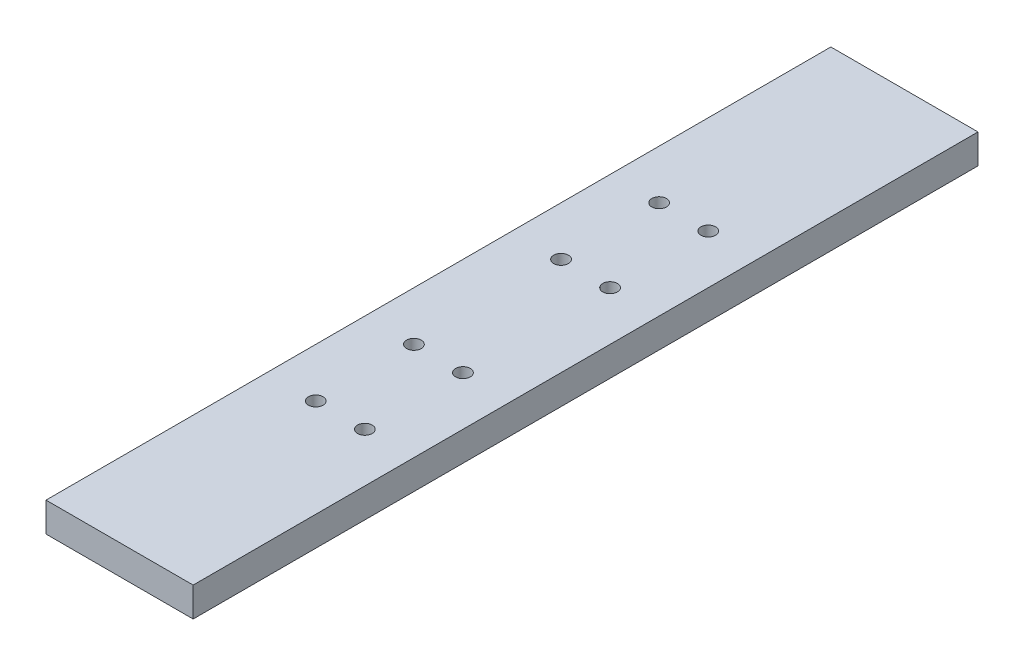
ISO-10303-21;
HEADER;
FILE_DESCRIPTION(('STEP AP214'),'2;1');
FILE_NAME('part.step','',(''),(''),'','','');
FILE_SCHEMA(('AUTOMOTIVE_DESIGN { 1 0 10303 214 1 1 1 1 }'));
ENDSEC;
DATA;
#1=APPLICATION_CONTEXT('core data for automotive mechanical design processes');
#2=APPLICATION_PROTOCOL_DEFINITION('international standard','automotive_design',2000,#1);
#3=PRODUCT_CONTEXT('',#1,'mechanical');
#4=PRODUCT('Part','Part','',(#3));
#5=PRODUCT_RELATED_PRODUCT_CATEGORY('part','',(#4));
#6=PRODUCT_DEFINITION_FORMATION('','',#4);
#7=PRODUCT_DEFINITION_CONTEXT('part definition',#1,'design');
#8=PRODUCT_DEFINITION('design','',#6,#7);
#9=PRODUCT_DEFINITION_SHAPE('','',#8);
#10=(LENGTH_UNIT() NAMED_UNIT(*) SI_UNIT(.MILLI.,.METRE.));
#11=(NAMED_UNIT(*) PLANE_ANGLE_UNIT() SI_UNIT($,.RADIAN.));
#12=(NAMED_UNIT(*) SI_UNIT($,.STERADIAN.) SOLID_ANGLE_UNIT());
#13=UNCERTAINTY_MEASURE_WITH_UNIT(LENGTH_MEASURE(1.E-05),#10,'distance_accuracy_value','');
#14=(GEOMETRIC_REPRESENTATION_CONTEXT(3) GLOBAL_UNCERTAINTY_ASSIGNED_CONTEXT((#13)) GLOBAL_UNIT_ASSIGNED_CONTEXT((#10,
#11,#12)) REPRESENTATION_CONTEXT('',''));
#15=CARTESIAN_POINT('',(0.,0.,0.));
#16=DIRECTION('',(0.,0.,1.));
#17=DIRECTION('',(1.,0.,0.));
#18=AXIS2_PLACEMENT_3D('',#15,#16,#17);
#19=CARTESIAN_POINT('',(15.,-3.,160.));
#20=DIRECTION('',(-1.,0.,0.));
#21=DIRECTION('',(0.,0.,1.));
#22=AXIS2_PLACEMENT_3D('',#19,#20,#21);
#23=PLANE('',#22);
#24=DIRECTION('',(0.,1.,0.));
#25=VECTOR('',#24,1.);
#26=CARTESIAN_POINT('',(15.,-3.,0.));
#27=LINE('',#26,#25);
#28=CARTESIAN_POINT('',(15.,-3.,0.));
#29=VERTEX_POINT('',#28);
#30=CARTESIAN_POINT('',(15.,3.,0.));
#31=VERTEX_POINT('',#30);
#32=EDGE_CURVE('E113',#29,#31,#27,.T.);
#33=ORIENTED_EDGE('',*,*,#32,.T.);
#34=DIRECTION('',(0.,0.,-1.));
#35=VECTOR('',#34,1.);
#36=CARTESIAN_POINT('',(15.,3.,160.));
#37=LINE('',#36,#35);
#38=CARTESIAN_POINT('',(15.,3.,160.));
#39=VERTEX_POINT('',#38);
#40=EDGE_CURVE('E11',#39,#31,#37,.T.);
#41=ORIENTED_EDGE('',*,*,#40,.F.);
#42=DIRECTION('',(0.,1.,0.));
#43=VECTOR('',#42,1.);
#44=CARTESIAN_POINT('',(15.,-3.,160.));
#45=LINE('',#44,#43);
#46=CARTESIAN_POINT('',(15.,-3.,160.));
#47=VERTEX_POINT('',#46);
#48=EDGE_CURVE('E97',#47,#39,#45,.T.);
#49=ORIENTED_EDGE('',*,*,#48,.F.);
#50=DIRECTION('',(0.,0.,-1.));
#51=VECTOR('',#50,1.);
#52=CARTESIAN_POINT('',(15.,-3.,160.));
#53=LINE('',#52,#51);
#54=EDGE_CURVE('E109',#47,#29,#53,.T.);
#55=ORIENTED_EDGE('',*,*,#54,.T.);
#56=EDGE_LOOP('',(#33,#41,#49,#55));
#57=FACE_BOUND('',#56,.T.);
#58=ADVANCED_FACE('F45',(#57),#23,.F.);
#59=CARTESIAN_POINT('',(-15.,3.,160.));
#60=DIRECTION('',(0.,-1.,0.));
#61=DIRECTION('',(0.,0.,-1.));
#62=AXIS2_PLACEMENT_3D('',#59,#60,#61);
#63=PLANE('',#62);
#64=CARTESIAN_POINT('',(-5.00000000000007,3.,95.));
#65=DIRECTION('',(0.,1.,0.));
#66=DIRECTION('',(0.,0.,1.));
#67=AXIS2_PLACEMENT_3D('',#64,#65,#66);
#68=CIRCLE('',#67,1.5);
#69=CARTESIAN_POINT('',(-5.00000000000007,3.,96.5));
#70=VERTEX_POINT('',#69);
#71=EDGE_CURVE('E162',#70,#70,#68,.T.);
#72=ORIENTED_EDGE('',*,*,#71,.F.);
#73=EDGE_LOOP('',(#72));
#74=FACE_BOUND('',#73,.T.);
#75=CARTESIAN_POINT('',(4.99999999999993,3.,95.));
#76=DIRECTION('',(0.,1.,0.));
#77=DIRECTION('',(0.,0.,1.));
#78=AXIS2_PLACEMENT_3D('',#75,#76,#77);
#79=CIRCLE('',#78,1.5);
#80=CARTESIAN_POINT('',(4.99999999999993,3.,96.5));
#81=VERTEX_POINT('',#80);
#82=EDGE_CURVE('E147',#81,#81,#79,.T.);
#83=ORIENTED_EDGE('',*,*,#82,.F.);
#84=EDGE_LOOP('',(#83));
#85=FACE_BOUND('',#84,.T.);
#86=CARTESIAN_POINT('',(5.,3.,115.));
#87=DIRECTION('',(0.,1.,0.));
#88=DIRECTION('',(0.,0.,1.));
#89=AXIS2_PLACEMENT_3D('',#86,#87,#88);
#90=CIRCLE('',#89,1.5);
#91=CARTESIAN_POINT('',(5.,3.,116.5));
#92=VERTEX_POINT('',#91);
#93=EDGE_CURVE('E146',#92,#92,#90,.T.);
#94=ORIENTED_EDGE('',*,*,#93,.F.);
#95=EDGE_LOOP('',(#94));
#96=FACE_BOUND('',#95,.T.);
#97=CARTESIAN_POINT('',(-5.00000000000007,3.,65.));
#98=DIRECTION('',(0.,1.,0.));
#99=DIRECTION('',(0.,0.,-1.));
#100=AXIS2_PLACEMENT_3D('',#97,#98,#99);
#101=CIRCLE('',#100,1.5);
#102=CARTESIAN_POINT('',(-5.00000000000007,3.,63.5));
#103=VERTEX_POINT('',#102);
#104=EDGE_CURVE('E138',#103,#103,#101,.T.);
#105=ORIENTED_EDGE('',*,*,#104,.F.);
#106=EDGE_LOOP('',(#105));
#107=FACE_BOUND('',#106,.T.);
#108=CARTESIAN_POINT('',(4.99999999999993,3.,65.));
#109=DIRECTION('',(0.,1.,0.));
#110=DIRECTION('',(0.,0.,-1.));
#111=AXIS2_PLACEMENT_3D('',#108,#109,#110);
#112=CIRCLE('',#111,1.5);
#113=CARTESIAN_POINT('',(4.99999999999993,3.,63.5));
#114=VERTEX_POINT('',#113);
#115=EDGE_CURVE('E163',#114,#114,#112,.T.);
#116=ORIENTED_EDGE('',*,*,#115,.F.);
#117=EDGE_LOOP('',(#116));
#118=FACE_BOUND('',#117,.T.);
#119=CARTESIAN_POINT('',(5.,3.,45.));
#120=DIRECTION('',(0.,1.,0.));
#121=DIRECTION('',(0.,0.,-1.));
#122=AXIS2_PLACEMENT_3D('',#119,#120,#121);
#123=CIRCLE('',#122,1.5);
#124=CARTESIAN_POINT('',(5.,3.,43.5));
#125=VERTEX_POINT('',#124);
#126=EDGE_CURVE('E186',#125,#125,#123,.T.);
#127=ORIENTED_EDGE('',*,*,#126,.F.);
#128=EDGE_LOOP('',(#127));
#129=FACE_BOUND('',#128,.T.);
#130=CARTESIAN_POINT('',(-5.,3.,45.));
#131=DIRECTION('',(0.,1.,0.));
#132=DIRECTION('',(0.,0.,-1.));
#133=AXIS2_PLACEMENT_3D('',#130,#131,#132);
#134=CIRCLE('',#133,1.5);
#135=CARTESIAN_POINT('',(-5.,3.,43.5));
#136=VERTEX_POINT('',#135);
#137=EDGE_CURVE('E178',#136,#136,#134,.T.);
#138=ORIENTED_EDGE('',*,*,#137,.F.);
#139=EDGE_LOOP('',(#138));
#140=FACE_BOUND('',#139,.T.);
#141=CARTESIAN_POINT('',(-5.,3.,115.));
#142=DIRECTION('',(0.,1.,0.));
#143=DIRECTION('',(0.,0.,1.));
#144=AXIS2_PLACEMENT_3D('',#141,#142,#143);
#145=CIRCLE('',#144,1.5);
#146=CARTESIAN_POINT('',(-5.,3.,116.5));
#147=VERTEX_POINT('',#146);
#148=EDGE_CURVE('E134',#147,#147,#145,.T.);
#149=ORIENTED_EDGE('',*,*,#148,.F.);
#150=EDGE_LOOP('',(#149));
#151=FACE_BOUND('',#150,.T.);
#152=DIRECTION('',(-1.,0.,0.));
#153=VECTOR('',#152,1.);
#154=CARTESIAN_POINT('',(-15.,3.,0.));
#155=LINE('',#154,#153);
#156=CARTESIAN_POINT('',(-15.,3.,0.));
#157=VERTEX_POINT('',#156);
#158=EDGE_CURVE('E102',#31,#157,#155,.T.);
#159=ORIENTED_EDGE('',*,*,#158,.T.);
#160=DIRECTION('',(0.,0.,-1.));
#161=VECTOR('',#160,1.);
#162=CARTESIAN_POINT('',(-15.,3.,160.));
#163=LINE('',#162,#161);
#164=CARTESIAN_POINT('',(-15.,3.,160.));
#165=VERTEX_POINT('',#164);
#166=EDGE_CURVE('E54',#165,#157,#163,.T.);
#167=ORIENTED_EDGE('',*,*,#166,.F.);
#168=DIRECTION('',(-1.,0.,0.));
#169=VECTOR('',#168,1.);
#170=CARTESIAN_POINT('',(-15.,3.,160.));
#171=LINE('',#170,#169);
#172=EDGE_CURVE('E92',#39,#165,#171,.T.);
#173=ORIENTED_EDGE('',*,*,#172,.F.);
#174=ORIENTED_EDGE('',*,*,#40,.T.);
#175=EDGE_LOOP('',(#159,#167,#173,#174));
#176=FACE_BOUND('',#175,.T.);
#177=ADVANCED_FACE('F101',(#74,#85,#96,#107,#118,#129,#140,#151,#176),#63,.F.);
#178=CARTESIAN_POINT('',(-15.,-3.,160.));
#179=DIRECTION('',(1.,0.,0.));
#180=DIRECTION('',(0.,0.,-1.));
#181=AXIS2_PLACEMENT_3D('',#178,#179,#180);
#182=PLANE('',#181);
#183=DIRECTION('',(0.,-1.,0.));
#184=VECTOR('',#183,1.);
#185=CARTESIAN_POINT('',(-15.,-3.,0.));
#186=LINE('',#185,#184);
#187=CARTESIAN_POINT('',(-15.,-3.,0.));
#188=VERTEX_POINT('',#187);
#189=EDGE_CURVE('E79',#157,#188,#186,.T.);
#190=ORIENTED_EDGE('',*,*,#189,.T.);
#191=DIRECTION('',(0.,0.,-1.));
#192=VECTOR('',#191,1.);
#193=CARTESIAN_POINT('',(-15.,-3.,160.));
#194=LINE('',#193,#192);
#195=CARTESIAN_POINT('',(-15.,-3.,160.));
#196=VERTEX_POINT('',#195);
#197=EDGE_CURVE('E104',#196,#188,#194,.T.);
#198=ORIENTED_EDGE('',*,*,#197,.F.);
#199=DIRECTION('',(0.,-1.,0.));
#200=VECTOR('',#199,1.);
#201=CARTESIAN_POINT('',(-15.,-3.,160.));
#202=LINE('',#201,#200);
#203=EDGE_CURVE('E95',#165,#196,#202,.T.);
#204=ORIENTED_EDGE('',*,*,#203,.F.);
#205=ORIENTED_EDGE('',*,*,#166,.T.);
#206=EDGE_LOOP('',(#190,#198,#204,#205));
#207=FACE_BOUND('',#206,.T.);
#208=ADVANCED_FACE('F105',(#207),#182,.F.);
#209=CARTESIAN_POINT('',(-15.,-3.,160.));
#210=DIRECTION('',(0.,1.,0.));
#211=DIRECTION('',(0.,0.,1.));
#212=AXIS2_PLACEMENT_3D('',#209,#210,#211);
#213=PLANE('',#212);
#214=CARTESIAN_POINT('',(-5.00000000000007,-3.,95.));
#215=DIRECTION('',(0.,1.,0.));
#216=DIRECTION('',(0.,0.,1.));
#217=AXIS2_PLACEMENT_3D('',#214,#215,#216);
#218=CIRCLE('',#217,1.5);
#219=CARTESIAN_POINT('',(-5.00000000000007,-3.,96.5));
#220=VERTEX_POINT('',#219);
#221=EDGE_CURVE('E158',#220,#220,#218,.T.);
#222=ORIENTED_EDGE('',*,*,#221,.T.);
#223=EDGE_LOOP('',(#222));
#224=FACE_BOUND('',#223,.T.);
#225=CARTESIAN_POINT('',(4.99999999999993,-3.,95.));
#226=DIRECTION('',(0.,1.,0.));
#227=DIRECTION('',(0.,0.,1.));
#228=AXIS2_PLACEMENT_3D('',#225,#226,#227);
#229=CIRCLE('',#228,1.5);
#230=CARTESIAN_POINT('',(4.99999999999993,-3.,96.5));
#231=VERTEX_POINT('',#230);
#232=EDGE_CURVE('E167',#231,#231,#229,.T.);
#233=ORIENTED_EDGE('',*,*,#232,.T.);
#234=EDGE_LOOP('',(#233));
#235=FACE_BOUND('',#234,.T.);
#236=CARTESIAN_POINT('',(5.,-3.,115.));
#237=DIRECTION('',(0.,1.,0.));
#238=DIRECTION('',(0.,0.,1.));
#239=AXIS2_PLACEMENT_3D('',#236,#237,#238);
#240=CIRCLE('',#239,1.5);
#241=CARTESIAN_POINT('',(5.,-3.,116.5));
#242=VERTEX_POINT('',#241);
#243=EDGE_CURVE('E142',#242,#242,#240,.T.);
#244=ORIENTED_EDGE('',*,*,#243,.T.);
#245=EDGE_LOOP('',(#244));
#246=FACE_BOUND('',#245,.T.);
#247=CARTESIAN_POINT('',(-5.00000000000007,-3.,65.));
#248=DIRECTION('',(0.,1.,0.));
#249=DIRECTION('',(0.,0.,-1.));
#250=AXIS2_PLACEMENT_3D('',#247,#248,#249);
#251=CIRCLE('',#250,1.5);
#252=CARTESIAN_POINT('',(-5.00000000000007,-3.,63.5));
#253=VERTEX_POINT('',#252);
#254=EDGE_CURVE('E151',#253,#253,#251,.T.);
#255=ORIENTED_EDGE('',*,*,#254,.T.);
#256=EDGE_LOOP('',(#255));
#257=FACE_BOUND('',#256,.T.);
#258=CARTESIAN_POINT('',(4.99999999999993,-3.,65.));
#259=DIRECTION('',(0.,1.,0.));
#260=DIRECTION('',(0.,0.,-1.));
#261=AXIS2_PLACEMENT_3D('',#258,#259,#260);
#262=CIRCLE('',#261,1.5);
#263=CARTESIAN_POINT('',(4.99999999999993,-3.,63.5));
#264=VERTEX_POINT('',#263);
#265=EDGE_CURVE('E190',#264,#264,#262,.T.);
#266=ORIENTED_EDGE('',*,*,#265,.T.);
#267=EDGE_LOOP('',(#266));
#268=FACE_BOUND('',#267,.T.);
#269=CARTESIAN_POINT('',(5.,-3.,45.));
#270=DIRECTION('',(0.,1.,0.));
#271=DIRECTION('',(0.,0.,-1.));
#272=AXIS2_PLACEMENT_3D('',#269,#270,#271);
#273=CIRCLE('',#272,1.5);
#274=CARTESIAN_POINT('',(5.,-3.,43.5));
#275=VERTEX_POINT('',#274);
#276=EDGE_CURVE('E182',#275,#275,#273,.T.);
#277=ORIENTED_EDGE('',*,*,#276,.T.);
#278=EDGE_LOOP('',(#277));
#279=FACE_BOUND('',#278,.T.);
#280=CARTESIAN_POINT('',(-5.,-3.,45.));
#281=DIRECTION('',(0.,1.,0.));
#282=DIRECTION('',(0.,0.,-1.));
#283=AXIS2_PLACEMENT_3D('',#280,#281,#282);
#284=CIRCLE('',#283,1.5);
#285=CARTESIAN_POINT('',(-5.,-3.,43.5));
#286=VERTEX_POINT('',#285);
#287=EDGE_CURVE('E174',#286,#286,#284,.T.);
#288=ORIENTED_EDGE('',*,*,#287,.T.);
#289=EDGE_LOOP('',(#288));
#290=FACE_BOUND('',#289,.T.);
#291=CARTESIAN_POINT('',(-5.,-3.,115.));
#292=DIRECTION('',(0.,1.,0.));
#293=DIRECTION('',(0.,0.,1.));
#294=AXIS2_PLACEMENT_3D('',#291,#292,#293);
#295=CIRCLE('',#294,1.5);
#296=CARTESIAN_POINT('',(-5.,-3.,116.5));
#297=VERTEX_POINT('',#296);
#298=EDGE_CURVE('E117',#297,#297,#295,.T.);
#299=ORIENTED_EDGE('',*,*,#298,.T.);
#300=EDGE_LOOP('',(#299));
#301=FACE_BOUND('',#300,.T.);
#302=DIRECTION('',(1.,0.,0.));
#303=VECTOR('',#302,1.);
#304=CARTESIAN_POINT('',(-15.,-3.,0.));
#305=LINE('',#304,#303);
#306=EDGE_CURVE('E85',#188,#29,#305,.T.);
#307=ORIENTED_EDGE('',*,*,#306,.T.);
#308=ORIENTED_EDGE('',*,*,#54,.F.);
#309=DIRECTION('',(1.,0.,0.));
#310=VECTOR('',#309,1.);
#311=CARTESIAN_POINT('',(-15.,-3.,160.));
#312=LINE('',#311,#310);
#313=EDGE_CURVE('E62',#196,#47,#312,.T.);
#314=ORIENTED_EDGE('',*,*,#313,.F.);
#315=ORIENTED_EDGE('',*,*,#197,.T.);
#316=EDGE_LOOP('',(#307,#308,#314,#315));
#317=FACE_BOUND('',#316,.T.);
#318=ADVANCED_FACE('F127',(#224,#235,#246,#257,#268,#279,#290,#301,#317),#213,.F.);
#319=CARTESIAN_POINT('',(0.,0.,160.));
#320=DIRECTION('',(0.,0.,-1.));
#321=DIRECTION('',(-1.,0.,0.));
#322=AXIS2_PLACEMENT_3D('',#319,#320,#321);
#323=PLANE('',#322);
#324=ORIENTED_EDGE('',*,*,#48,.T.);
#325=ORIENTED_EDGE('',*,*,#172,.T.);
#326=ORIENTED_EDGE('',*,*,#203,.T.);
#327=ORIENTED_EDGE('',*,*,#313,.T.);
#328=EDGE_LOOP('',(#324,#325,#326,#327));
#329=FACE_BOUND('',#328,.T.);
#330=ADVANCED_FACE('F93',(#329),#323,.F.);
#331=CARTESIAN_POINT('',(0.,0.,0.));
#332=DIRECTION('',(0.,0.,-1.));
#333=DIRECTION('',(-1.,0.,0.));
#334=AXIS2_PLACEMENT_3D('',#331,#332,#333);
#335=PLANE('',#334);
#336=ORIENTED_EDGE('',*,*,#32,.F.);
#337=ORIENTED_EDGE('',*,*,#306,.F.);
#338=ORIENTED_EDGE('',*,*,#189,.F.);
#339=ORIENTED_EDGE('',*,*,#158,.F.);
#340=EDGE_LOOP('',(#336,#337,#338,#339));
#341=FACE_BOUND('',#340,.T.);
#342=ADVANCED_FACE('F130',(#341),#335,.T.);
#343=CARTESIAN_POINT('',(-5.,-3.,115.));
#344=DIRECTION('',(0.,1.,0.));
#345=DIRECTION('',(0.,0.,1.));
#346=AXIS2_PLACEMENT_3D('',#343,#344,#345);
#347=CYLINDRICAL_SURFACE('',#346,1.5);
#348=ORIENTED_EDGE('',*,*,#298,.F.);
#349=EDGE_LOOP('',(#348));
#350=FACE_BOUND('',#349,.T.);
#351=ORIENTED_EDGE('',*,*,#148,.T.);
#352=EDGE_LOOP('',(#351));
#353=FACE_BOUND('',#352,.T.);
#354=ADVANCED_FACE('F209',(#350,#353),#347,.F.);
#355=CARTESIAN_POINT('',(-5.,-3.,45.));
#356=DIRECTION('',(0.,1.,0.));
#357=DIRECTION('',(0.,0.,1.));
#358=AXIS2_PLACEMENT_3D('',#355,#356,#357);
#359=CYLINDRICAL_SURFACE('',#358,1.5);
#360=ORIENTED_EDGE('',*,*,#287,.F.);
#361=EDGE_LOOP('',(#360));
#362=FACE_BOUND('',#361,.T.);
#363=ORIENTED_EDGE('',*,*,#137,.T.);
#364=EDGE_LOOP('',(#363));
#365=FACE_BOUND('',#364,.T.);
#366=ADVANCED_FACE('F211',(#362,#365),#359,.F.);
#367=CARTESIAN_POINT('',(5.,-3.,45.));
#368=DIRECTION('',(0.,1.,0.));
#369=DIRECTION('',(0.,0.,1.));
#370=AXIS2_PLACEMENT_3D('',#367,#368,#369);
#371=CYLINDRICAL_SURFACE('',#370,1.5);
#372=ORIENTED_EDGE('',*,*,#276,.F.);
#373=EDGE_LOOP('',(#372));
#374=FACE_BOUND('',#373,.T.);
#375=ORIENTED_EDGE('',*,*,#126,.T.);
#376=EDGE_LOOP('',(#375));
#377=FACE_BOUND('',#376,.T.);
#378=ADVANCED_FACE('F218',(#374,#377),#371,.F.);
#379=CARTESIAN_POINT('',(4.99999999999993,-3.,65.));
#380=DIRECTION('',(0.,1.,0.));
#381=DIRECTION('',(0.,0.,1.));
#382=AXIS2_PLACEMENT_3D('',#379,#380,#381);
#383=CYLINDRICAL_SURFACE('',#382,1.5);
#384=ORIENTED_EDGE('',*,*,#265,.F.);
#385=EDGE_LOOP('',(#384));
#386=FACE_BOUND('',#385,.T.);
#387=ORIENTED_EDGE('',*,*,#115,.T.);
#388=EDGE_LOOP('',(#387));
#389=FACE_BOUND('',#388,.T.);
#390=ADVANCED_FACE('F198',(#386,#389),#383,.F.);
#391=CARTESIAN_POINT('',(-5.00000000000007,-3.,65.));
#392=DIRECTION('',(0.,1.,0.));
#393=DIRECTION('',(0.,0.,1.));
#394=AXIS2_PLACEMENT_3D('',#391,#392,#393);
#395=CYLINDRICAL_SURFACE('',#394,1.5);
#396=ORIENTED_EDGE('',*,*,#254,.F.);
#397=EDGE_LOOP('',(#396));
#398=FACE_BOUND('',#397,.T.);
#399=ORIENTED_EDGE('',*,*,#104,.T.);
#400=EDGE_LOOP('',(#399));
#401=FACE_BOUND('',#400,.T.);
#402=ADVANCED_FACE('F286',(#398,#401),#395,.F.);
#403=CARTESIAN_POINT('',(5.,-3.,115.));
#404=DIRECTION('',(0.,1.,0.));
#405=DIRECTION('',(0.,0.,1.));
#406=AXIS2_PLACEMENT_3D('',#403,#404,#405);
#407=CYLINDRICAL_SURFACE('',#406,1.5);
#408=ORIENTED_EDGE('',*,*,#243,.F.);
#409=EDGE_LOOP('',(#408));
#410=FACE_BOUND('',#409,.T.);
#411=ORIENTED_EDGE('',*,*,#93,.T.);
#412=EDGE_LOOP('',(#411));
#413=FACE_BOUND('',#412,.T.);
#414=ADVANCED_FACE('F296',(#410,#413),#407,.F.);
#415=CARTESIAN_POINT('',(4.99999999999993,-3.,95.));
#416=DIRECTION('',(0.,1.,0.));
#417=DIRECTION('',(0.,0.,1.));
#418=AXIS2_PLACEMENT_3D('',#415,#416,#417);
#419=CYLINDRICAL_SURFACE('',#418,1.5);
#420=ORIENTED_EDGE('',*,*,#232,.F.);
#421=EDGE_LOOP('',(#420));
#422=FACE_BOUND('',#421,.T.);
#423=ORIENTED_EDGE('',*,*,#82,.T.);
#424=EDGE_LOOP('',(#423));
#425=FACE_BOUND('',#424,.T.);
#426=ADVANCED_FACE('F306',(#422,#425),#419,.F.);
#427=CARTESIAN_POINT('',(-5.00000000000007,-3.,95.));
#428=DIRECTION('',(0.,1.,0.));
#429=DIRECTION('',(0.,0.,1.));
#430=AXIS2_PLACEMENT_3D('',#427,#428,#429);
#431=CYLINDRICAL_SURFACE('',#430,1.5);
#432=ORIENTED_EDGE('',*,*,#221,.F.);
#433=EDGE_LOOP('',(#432));
#434=FACE_BOUND('',#433,.T.);
#435=ORIENTED_EDGE('',*,*,#71,.T.);
#436=EDGE_LOOP('',(#435));
#437=FACE_BOUND('',#436,.T.);
#438=ADVANCED_FACE('F315',(#434,#437),#431,.F.);
#439=CLOSED_SHELL('',(#58,#177,#208,#318,#330,#342,#354,#366,#378,#390,#402,#414,#426,#438));
#440=MANIFOLD_SOLID_BREP('B2',#439);
#441=ADVANCED_BREP_SHAPE_REPRESENTATION('',(#18,#440),#14);
#442=SHAPE_DEFINITION_REPRESENTATION(#9,#441);
ENDSEC;
END-ISO-10303-21;
